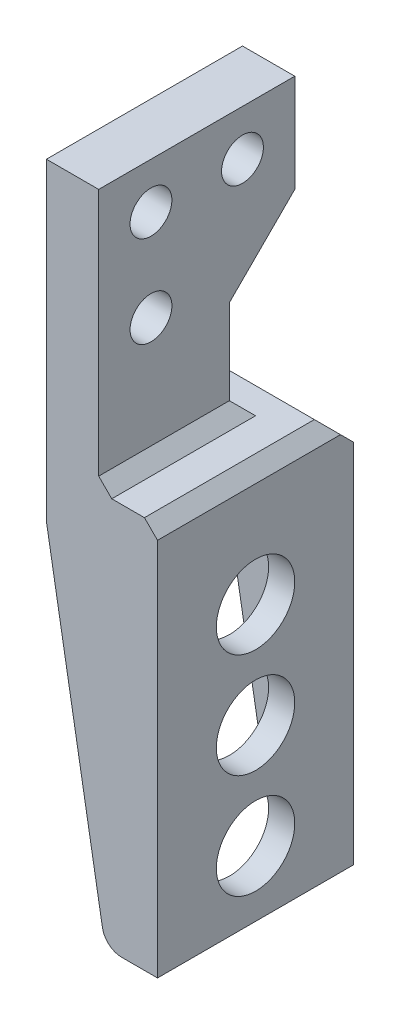
ISO-10303-21;
HEADER;
FILE_DESCRIPTION(('STEP AP214'),'2;1');
FILE_NAME('part.step','',(''),(''),'','','');
FILE_SCHEMA(('AUTOMOTIVE_DESIGN { 1 0 10303 214 1 1 1 1 }'));
ENDSEC;
DATA;
#1=APPLICATION_CONTEXT('core data for automotive mechanical design processes');
#2=APPLICATION_PROTOCOL_DEFINITION('international standard','automotive_design',2000,#1);
#3=PRODUCT_CONTEXT('',#1,'mechanical');
#4=PRODUCT('Part','Part','',(#3));
#5=PRODUCT_RELATED_PRODUCT_CATEGORY('part','',(#4));
#6=PRODUCT_DEFINITION_FORMATION('','',#4);
#7=PRODUCT_DEFINITION_CONTEXT('part definition',#1,'design');
#8=PRODUCT_DEFINITION('design','',#6,#7);
#9=PRODUCT_DEFINITION_SHAPE('','',#8);
#10=(LENGTH_UNIT() NAMED_UNIT(*) SI_UNIT(.MILLI.,.METRE.));
#11=(NAMED_UNIT(*) PLANE_ANGLE_UNIT() SI_UNIT($,.RADIAN.));
#12=(NAMED_UNIT(*) SI_UNIT($,.STERADIAN.) SOLID_ANGLE_UNIT());
#13=UNCERTAINTY_MEASURE_WITH_UNIT(LENGTH_MEASURE(1.E-05),#10,'distance_accuracy_value','');
#14=(GEOMETRIC_REPRESENTATION_CONTEXT(3) GLOBAL_UNCERTAINTY_ASSIGNED_CONTEXT((#13)) GLOBAL_UNIT_ASSIGNED_CONTEXT((#10,
#11,#12)) REPRESENTATION_CONTEXT('',''));
#15=CARTESIAN_POINT('',(0.,0.,0.));
#16=DIRECTION('',(0.,0.,1.));
#17=DIRECTION('',(1.,0.,0.));
#18=AXIS2_PLACEMENT_3D('',#15,#16,#17);
#19=CARTESIAN_POINT('',(0.,0.,-7.5));
#20=DIRECTION('',(0.,0.,-1.));
#21=DIRECTION('',(-1.,0.,0.));
#22=AXIS2_PLACEMENT_3D('',#19,#20,#21);
#23=PLANE('',#22);
#24=DIRECTION('',(0.,-1.,0.));
#25=VECTOR('',#24,1.);
#26=CARTESIAN_POINT('',(0.,-24.,-7.5));
#27=LINE('',#26,#25);
#28=CARTESIAN_POINT('',(0.,-22.,-7.5));
#29=VERTEX_POINT('',#28);
#30=CARTESIAN_POINT('',(0.,-24.,-7.5));
#31=VERTEX_POINT('',#30);
#32=EDGE_CURVE('E242',#29,#31,#27,.T.);
#33=ORIENTED_EDGE('',*,*,#32,.F.);
#34=DIRECTION('',(1.,0.,0.));
#35=VECTOR('',#34,1.);
#36=CARTESIAN_POINT('',(7.5,-22.,-7.5));
#37=LINE('',#36,#35);
#38=CARTESIAN_POINT('',(8.5,-22.,-7.5));
#39=VERTEX_POINT('',#38);
#40=EDGE_CURVE('E58',#29,#39,#37,.T.);
#41=ORIENTED_EDGE('',*,*,#40,.T.);
#42=DIRECTION('',(0.,1.,0.));
#43=VECTOR('',#42,1.);
#44=CARTESIAN_POINT('',(8.5,-20.,-7.5));
#45=LINE('',#44,#43);
#46=CARTESIAN_POINT('',(8.5,-50.,-7.5));
#47=VERTEX_POINT('',#46);
#48=EDGE_CURVE('E271',#47,#39,#45,.T.);
#49=ORIENTED_EDGE('',*,*,#48,.F.);
#50=DIRECTION('',(1.,0.,0.));
#51=VECTOR('',#50,1.);
#52=CARTESIAN_POINT('',(8.5,-50.,-7.5));
#53=LINE('',#52,#51);
#54=CARTESIAN_POINT('',(5.76268555407217,-50.,-7.5));
#55=VERTEX_POINT('',#54);
#56=EDGE_CURVE('E269',#55,#47,#53,.T.);
#57=ORIENTED_EDGE('',*,*,#56,.F.);
#58=CARTESIAN_POINT('',(5.76268555407217,-48.5,-7.5));
#59=DIRECTION('',(0.,0.,-1.));
#60=DIRECTION('',(-1.,0.,0.));
#61=AXIS2_PLACEMENT_3D('',#58,#59,#60);
#62=CIRCLE('',#61,1.5);
#63=CARTESIAN_POINT('',(4.284659795289,-48.7558121505586,-7.5));
#64=VERTEX_POINT('',#63);
#65=EDGE_CURVE('E336',#55,#64,#62,.T.);
#66=ORIENTED_EDGE('',*,*,#65,.T.);
#67=DIRECTION('',(0.170541433705751,-0.985350505855448,0.));
#68=VECTOR('',#67,1.);
#69=CARTESIAN_POINT('',(4.5,-50.,-7.5));
#70=LINE('',#69,#68);
#71=EDGE_CURVE('E266',#31,#64,#70,.T.);
#72=ORIENTED_EDGE('',*,*,#71,.F.);
#73=EDGE_LOOP('',(#33,#41,#49,#57,#66,#72));
#74=FACE_BOUND('',#73,.T.);
#75=ADVANCED_FACE('F35',(#74),#23,.T.);
#76=CARTESIAN_POINT('',(4.5,-50.,7.5));
#77=DIRECTION('',(0.985350505855448,0.170541433705751,0.));
#78=DIRECTION('',(-0.170541433705751,0.985350505855448,0.));
#79=AXIS2_PLACEMENT_3D('',#76,#77,#78);
#80=PLANE('',#79);
#81=ORIENTED_EDGE('',*,*,#71,.T.);
#82=DIRECTION('',(0.,0.,-1.));
#83=VECTOR('',#82,1.);
#84=CARTESIAN_POINT('',(4.284659795289,-48.7558121505586,7.5));
#85=LINE('',#84,#83);
#86=CARTESIAN_POINT('',(4.284659795289,-48.7558121505586,-5.5));
#87=VERTEX_POINT('',#86);
#88=EDGE_CURVE('E338',#64,#87,#85,.F.);
#89=ORIENTED_EDGE('',*,*,#88,.T.);
#90=DIRECTION('',(-0.170541433705751,0.985350505855448,0.));
#91=VECTOR('',#90,1.);
#92=CARTESIAN_POINT('',(4.5,-50.,-5.5));
#93=LINE('',#92,#91);
#94=CARTESIAN_POINT('',(0.51923076923077,-27.,-5.5));
#95=VERTEX_POINT('',#94);
#96=EDGE_CURVE('E240',#87,#95,#93,.T.);
#97=ORIENTED_EDGE('',*,*,#96,.T.);
#98=CARTESIAN_POINT('',(0.519230769230771,-27.,-2.5));
#99=DIRECTION('',(0.985350505855448,0.170541433705751,0.));
#100=DIRECTION('',(-0.170541433705751,0.985350505855448,0.));
#101=AXIS2_PLACEMENT_3D('',#98,#99,#100);
#102=ELLIPSE('',#101,3.0446018773751,3.);
#103=CARTESIAN_POINT('',(0.,-24.,-2.5));
#104=VERTEX_POINT('',#103);
#105=EDGE_CURVE('E319',#95,#104,#102,.T.);
#106=ORIENTED_EDGE('',*,*,#105,.T.);
#107=DIRECTION('',(0.,0.,-1.));
#108=VECTOR('',#107,1.);
#109=CARTESIAN_POINT('',(0.,-24.,7.5));
#110=LINE('',#109,#108);
#111=EDGE_CURVE('E284',#104,#31,#110,.T.);
#112=ORIENTED_EDGE('',*,*,#111,.T.);
#113=EDGE_LOOP('',(#81,#89,#97,#106,#112));
#114=FACE_BOUND('',#113,.T.);
#115=ADVANCED_FACE('F452',(#114),#80,.F.);
#116=CARTESIAN_POINT('',(0.,-24.,7.5));
#117=DIRECTION('',(1.,0.,0.));
#118=DIRECTION('',(0.,0.,-1.));
#119=AXIS2_PLACEMENT_3D('',#116,#117,#118);
#120=PLANE('',#119);
#121=CARTESIAN_POINT('',(0.,-3.5,3.5));
#122=DIRECTION('',(-1.,0.,0.));
#123=DIRECTION('',(0.,0.,1.));
#124=AXIS2_PLACEMENT_3D('',#121,#122,#123);
#125=CIRCLE('',#124,1.6);
#126=CARTESIAN_POINT('',(0.,-3.5,5.1));
#127=VERTEX_POINT('',#126);
#128=EDGE_CURVE('E737',#127,#127,#125,.T.);
#129=ORIENTED_EDGE('',*,*,#128,.F.);
#130=EDGE_LOOP('',(#129));
#131=FACE_BOUND('',#130,.T.);
#132=CARTESIAN_POINT('',(0.,-10.5,3.5));
#133=DIRECTION('',(-1.,0.,0.));
#134=DIRECTION('',(0.,0.,1.));
#135=AXIS2_PLACEMENT_3D('',#132,#133,#134);
#136=CIRCLE('',#135,1.6);
#137=CARTESIAN_POINT('',(0.,-10.5,5.1));
#138=VERTEX_POINT('',#137);
#139=EDGE_CURVE('E365',#138,#138,#136,.T.);
#140=ORIENTED_EDGE('',*,*,#139,.F.);
#141=EDGE_LOOP('',(#140));
#142=FACE_BOUND('',#141,.T.);
#143=CARTESIAN_POINT('',(0.,-3.5,-3.5));
#144=DIRECTION('',(-1.,0.,0.));
#145=DIRECTION('',(0.,0.,1.));
#146=AXIS2_PLACEMENT_3D('',#143,#144,#145);
#147=CIRCLE('',#146,1.6);
#148=CARTESIAN_POINT('',(0.,-3.5,-1.9));
#149=VERTEX_POINT('',#148);
#150=EDGE_CURVE('E216',#149,#149,#147,.T.);
#151=ORIENTED_EDGE('',*,*,#150,.F.);
#152=EDGE_LOOP('',(#151));
#153=FACE_BOUND('',#152,.T.);
#154=DIRECTION('',(0.,0.,1.));
#155=VECTOR('',#154,1.);
#156=CARTESIAN_POINT('',(0.,-20.,-7.5));
#157=LINE('',#156,#155);
#158=CARTESIAN_POINT('',(0.,-20.,-5.5));
#159=VERTEX_POINT('',#158);
#160=CARTESIAN_POINT('',(0.,-20.,-3.5));
#161=VERTEX_POINT('',#160);
#162=EDGE_CURVE('E194',#159,#161,#157,.T.);
#163=ORIENTED_EDGE('',*,*,#162,.F.);
#164=DIRECTION('',(0.,-0.707106781186549,-0.707106781186546));
#165=VECTOR('',#164,1.);
#166=CARTESIAN_POINT('',(0.,-20.,-5.5));
#167=LINE('',#166,#165);
#168=EDGE_CURVE('E368',#159,#29,#167,.T.);
#169=ORIENTED_EDGE('',*,*,#168,.T.);
#170=ORIENTED_EDGE('',*,*,#32,.T.);
#171=ORIENTED_EDGE('',*,*,#111,.F.);
#172=DIRECTION('',(0.,0.,-1.));
#173=VECTOR('',#172,1.);
#174=CARTESIAN_POINT('',(0.,-24.,5.5));
#175=LINE('',#174,#173);
#176=CARTESIAN_POINT('',(0.,-24.,2.5));
#177=VERTEX_POINT('',#176);
#178=EDGE_CURVE('E225',#177,#104,#175,.T.);
#179=ORIENTED_EDGE('',*,*,#178,.F.);
#180=CARTESIAN_POINT('',(0.,-24.,7.5));
#181=VERTEX_POINT('',#180);
#182=EDGE_CURVE('E285',#181,#177,#110,.T.);
#183=ORIENTED_EDGE('',*,*,#182,.F.);
#184=DIRECTION('',(0.,-1.,0.));
#185=VECTOR('',#184,1.);
#186=CARTESIAN_POINT('',(0.,-24.,7.5));
#187=LINE('',#186,#185);
#188=CARTESIAN_POINT('',(0.,0.,7.5));
#189=VERTEX_POINT('',#188);
#190=EDGE_CURVE('E243',#189,#181,#187,.T.);
#191=ORIENTED_EDGE('',*,*,#190,.F.);
#192=DIRECTION('',(0.,0.,-1.));
#193=VECTOR('',#192,1.);
#194=CARTESIAN_POINT('',(0.,0.,7.5));
#195=LINE('',#194,#193);
#196=CARTESIAN_POINT('',(0.,0.,-7.5));
#197=VERTEX_POINT('',#196);
#198=EDGE_CURVE('E262',#189,#197,#195,.T.);
#199=ORIENTED_EDGE('',*,*,#198,.T.);
#200=CARTESIAN_POINT('',(0.,-7.49999999999995,-7.5));
#201=VERTEX_POINT('',#200);
#202=EDGE_CURVE('E263',#197,#201,#27,.T.);
#203=ORIENTED_EDGE('',*,*,#202,.T.);
#204=DIRECTION('',(0.,0.707106781186551,-0.707106781186544));
#205=VECTOR('',#204,1.);
#206=CARTESIAN_POINT('',(0.,-12.5,-2.5));
#207=LINE('',#206,#205);
#208=CARTESIAN_POINT('',(0.,-12.5,-2.5));
#209=VERTEX_POINT('',#208);
#210=EDGE_CURVE('E210',#209,#201,#207,.T.);
#211=ORIENTED_EDGE('',*,*,#210,.F.);
#212=DIRECTION('',(0.,1.,0.));
#213=VECTOR('',#212,1.);
#214=CARTESIAN_POINT('',(0.,-12.5,-2.5));
#215=LINE('',#214,#213);
#216=CARTESIAN_POINT('',(0.,-19.,-2.5));
#217=VERTEX_POINT('',#216);
#218=EDGE_CURVE('E190',#217,#209,#215,.T.);
#219=ORIENTED_EDGE('',*,*,#218,.F.);
#220=DIRECTION('',(0.,0.707106781186552,0.707106781186543));
#221=VECTOR('',#220,1.);
#222=CARTESIAN_POINT('',(0.,-16.5,0.));
#223=LINE('',#222,#221);
#224=EDGE_CURVE('E356',#217,#161,#223,.F.);
#225=ORIENTED_EDGE('',*,*,#224,.T.);
#226=EDGE_LOOP('',(#163,#169,#170,#171,#179,#183,#191,#199,#203,#211,#219,#225));
#227=FACE_BOUND('',#226,.T.);
#228=ADVANCED_FACE('F372',(#131,#142,#153,#227),#120,.F.);
#229=DIRECTION('',(0.170541433705751,-0.985350505855448,0.));
#230=VECTOR('',#229,1.);
#231=CARTESIAN_POINT('',(4.5,-50.,5.5));
#232=LINE('',#231,#230);
#233=CARTESIAN_POINT('',(0.51923076923077,-27.,5.5));
#234=VERTEX_POINT('',#233);
#235=CARTESIAN_POINT('',(4.284659795289,-48.7558121505586,5.5));
#236=VERTEX_POINT('',#235);
#237=EDGE_CURVE('E236',#234,#236,#232,.T.);
#238=ORIENTED_EDGE('',*,*,#237,.T.);
#239=DIRECTION('',(0.,0.,-1.));
#240=VECTOR('',#239,1.);
#241=CARTESIAN_POINT('',(4.284659795289,-48.7558121505586,7.5));
#242=LINE('',#241,#240);
#243=CARTESIAN_POINT('',(4.284659795289,-48.7558121505586,7.5));
#244=VERTEX_POINT('',#243);
#245=EDGE_CURVE('E332',#236,#244,#242,.F.);
#246=ORIENTED_EDGE('',*,*,#245,.T.);
#247=DIRECTION('',(0.170541433705751,-0.985350505855448,0.));
#248=VECTOR('',#247,1.);
#249=CARTESIAN_POINT('',(4.5,-50.,7.5));
#250=LINE('',#249,#248);
#251=EDGE_CURVE('E246',#181,#244,#250,.T.);
#252=ORIENTED_EDGE('',*,*,#251,.F.);
#253=ORIENTED_EDGE('',*,*,#182,.T.);
#254=CARTESIAN_POINT('',(0.51923076923077,-27.,2.5));
#255=DIRECTION('',(0.985350505855448,0.170541433705751,0.));
#256=DIRECTION('',(0.170541433705751,-0.985350505855448,0.));
#257=AXIS2_PLACEMENT_3D('',#254,#255,#256);
#258=ELLIPSE('',#257,3.0446018773751,3.);
#259=EDGE_CURVE('E322',#177,#234,#258,.T.);
#260=ORIENTED_EDGE('',*,*,#259,.T.);
#261=EDGE_LOOP('',(#238,#246,#252,#253,#260));
#262=FACE_BOUND('',#261,.T.);
#263=ADVANCED_FACE('F410',(#262),#80,.F.);
#264=CARTESIAN_POINT('',(8.5,-50.,7.5));
#265=DIRECTION('',(0.,1.,0.));
#266=DIRECTION('',(0.,0.,1.));
#267=AXIS2_PLACEMENT_3D('',#264,#265,#266);
#268=PLANE('',#267);
#269=DIRECTION('',(1.,0.,0.));
#270=VECTOR('',#269,1.);
#271=CARTESIAN_POINT('',(8.5,-50.,7.5));
#272=LINE('',#271,#270);
#273=CARTESIAN_POINT('',(5.76268555407217,-50.,7.5));
#274=VERTEX_POINT('',#273);
#275=CARTESIAN_POINT('',(8.5,-50.,7.5));
#276=VERTEX_POINT('',#275);
#277=EDGE_CURVE('E250',#274,#276,#272,.T.);
#278=ORIENTED_EDGE('',*,*,#277,.F.);
#279=DIRECTION('',(0.,0.,-1.));
#280=VECTOR('',#279,1.);
#281=CARTESIAN_POINT('',(5.76268555407217,-50.,7.5));
#282=LINE('',#281,#280);
#283=CARTESIAN_POINT('',(5.76268555407217,-50.,5.5));
#284=VERTEX_POINT('',#283);
#285=EDGE_CURVE('E327',#274,#284,#282,.T.);
#286=ORIENTED_EDGE('',*,*,#285,.T.);
#287=DIRECTION('',(-1.,0.,0.));
#288=VECTOR('',#287,1.);
#289=CARTESIAN_POINT('',(6.5,-50.,5.5));
#290=LINE('',#289,#288);
#291=CARTESIAN_POINT('',(6.5,-50.,5.5));
#292=VERTEX_POINT('',#291);
#293=EDGE_CURVE('E226',#292,#284,#290,.T.);
#294=ORIENTED_EDGE('',*,*,#293,.F.);
#295=DIRECTION('',(0.,0.,1.));
#296=VECTOR('',#295,1.);
#297=CARTESIAN_POINT('',(6.5,-50.,5.5));
#298=LINE('',#297,#296);
#299=CARTESIAN_POINT('',(6.50000000000001,-50.,-5.5));
#300=VERTEX_POINT('',#299);
#301=EDGE_CURVE('E202',#300,#292,#298,.T.);
#302=ORIENTED_EDGE('',*,*,#301,.F.);
#303=DIRECTION('',(-1.,0.,0.));
#304=VECTOR('',#303,1.);
#305=CARTESIAN_POINT('',(8.50000000000001,-50.,-5.5));
#306=LINE('',#305,#304);
#307=CARTESIAN_POINT('',(5.76268555407217,-50.,-5.5));
#308=VERTEX_POINT('',#307);
#309=EDGE_CURVE('E287',#300,#308,#306,.T.);
#310=ORIENTED_EDGE('',*,*,#309,.T.);
#311=DIRECTION('',(0.,0.,-1.));
#312=VECTOR('',#311,1.);
#313=CARTESIAN_POINT('',(5.76268555407217,-50.,7.5));
#314=LINE('',#313,#312);
#315=EDGE_CURVE('E324',#308,#55,#314,.T.);
#316=ORIENTED_EDGE('',*,*,#315,.T.);
#317=ORIENTED_EDGE('',*,*,#56,.T.);
#318=DIRECTION('',(0.,0.,-1.));
#319=VECTOR('',#318,1.);
#320=CARTESIAN_POINT('',(8.5,-50.,7.5));
#321=LINE('',#320,#319);
#322=EDGE_CURVE('E281',#276,#47,#321,.T.);
#323=ORIENTED_EDGE('',*,*,#322,.F.);
#324=EDGE_LOOP('',(#278,#286,#294,#302,#310,#316,#317,#323));
#325=FACE_BOUND('',#324,.T.);
#326=ADVANCED_FACE('F436',(#325),#268,.F.);
#327=CARTESIAN_POINT('',(8.5,-20.,7.5));
#328=DIRECTION('',(-1.,0.,0.));
#329=DIRECTION('',(0.,-1.,0.));
#330=AXIS2_PLACEMENT_3D('',#327,#328,#329);
#331=PLANE('',#330);
#332=CARTESIAN_POINT('',(8.5,-29.,0.));
#333=DIRECTION('',(-1.,0.,0.));
#334=DIRECTION('',(0.,0.,1.));
#335=AXIS2_PLACEMENT_3D('',#332,#333,#334);
#336=CIRCLE('',#335,3.);
#337=CARTESIAN_POINT('',(8.5,-29.,3.));
#338=VERTEX_POINT('',#337);
#339=EDGE_CURVE('E741',#338,#338,#336,.T.);
#340=ORIENTED_EDGE('',*,*,#339,.T.);
#341=EDGE_LOOP('',(#340));
#342=FACE_BOUND('',#341,.T.);
#343=CARTESIAN_POINT('',(8.5,-37.,0.));
#344=DIRECTION('',(-1.,0.,0.));
#345=DIRECTION('',(0.,0.,1.));
#346=AXIS2_PLACEMENT_3D('',#343,#344,#345);
#347=CIRCLE('',#346,3.);
#348=CARTESIAN_POINT('',(8.5,-37.,3.));
#349=VERTEX_POINT('',#348);
#350=EDGE_CURVE('E743',#349,#349,#347,.T.);
#351=ORIENTED_EDGE('',*,*,#350,.T.);
#352=EDGE_LOOP('',(#351));
#353=FACE_BOUND('',#352,.T.);
#354=CARTESIAN_POINT('',(8.5,-45.,0.));
#355=DIRECTION('',(-1.,0.,0.));
#356=DIRECTION('',(0.,0.,1.));
#357=AXIS2_PLACEMENT_3D('',#354,#355,#356);
#358=CIRCLE('',#357,3.);
#359=CARTESIAN_POINT('',(8.5,-45.,3.));
#360=VERTEX_POINT('',#359);
#361=EDGE_CURVE('E748',#360,#360,#358,.T.);
#362=ORIENTED_EDGE('',*,*,#361,.T.);
#363=EDGE_LOOP('',(#362));
#364=FACE_BOUND('',#363,.T.);
#365=ORIENTED_EDGE('',*,*,#48,.T.);
#366=DIRECTION('',(0.,0.707106781186549,0.707106781186546));
#367=VECTOR('',#366,1.);
#368=CARTESIAN_POINT('',(8.5,-20.,-5.5));
#369=LINE('',#368,#367);
#370=CARTESIAN_POINT('',(8.5,-21.,-6.5));
#371=VERTEX_POINT('',#370);
#372=EDGE_CURVE('E44',#39,#371,#369,.T.);
#373=ORIENTED_EDGE('',*,*,#372,.T.);
#374=DIRECTION('',(0.,0.,1.));
#375=VECTOR('',#374,1.);
#376=CARTESIAN_POINT('',(8.5,-21.,7.5));
#377=LINE('',#376,#375);
#378=CARTESIAN_POINT('',(8.5,-21.,7.5));
#379=VERTEX_POINT('',#378);
#380=EDGE_CURVE('E349',#371,#379,#377,.T.);
#381=ORIENTED_EDGE('',*,*,#380,.T.);
#382=DIRECTION('',(0.,1.,0.));
#383=VECTOR('',#382,1.);
#384=CARTESIAN_POINT('',(8.5,-20.,7.5));
#385=LINE('',#384,#383);
#386=EDGE_CURVE('E252',#276,#379,#385,.T.);
#387=ORIENTED_EDGE('',*,*,#386,.F.);
#388=ORIENTED_EDGE('',*,*,#322,.T.);
#389=EDGE_LOOP('',(#365,#373,#381,#387,#388));
#390=FACE_BOUND('',#389,.T.);
#391=ADVANCED_FACE('F439',(#342,#353,#364,#390),#331,.F.);
#392=CARTESIAN_POINT('',(4.,-20.,7.5));
#393=DIRECTION('',(0.,-1.,0.));
#394=DIRECTION('',(1.,0.,0.));
#395=AXIS2_PLACEMENT_3D('',#392,#393,#394);
#396=PLANE('',#395);
#397=DIRECTION('',(0.,0.,-1.));
#398=VECTOR('',#397,1.);
#399=CARTESIAN_POINT('',(7.50000000000001,-20.,7.5));
#400=LINE('',#399,#398);
#401=CARTESIAN_POINT('',(7.50000000000001,-20.,7.5));
#402=VERTEX_POINT('',#401);
#403=CARTESIAN_POINT('',(7.50000000000001,-20.,-5.5));
#404=VERTEX_POINT('',#403);
#405=EDGE_CURVE('E346',#402,#404,#400,.T.);
#406=ORIENTED_EDGE('',*,*,#405,.T.);
#407=DIRECTION('',(-1.,0.,0.));
#408=VECTOR('',#407,1.);
#409=CARTESIAN_POINT('',(0.,-20.,-5.5));
#410=LINE('',#409,#408);
#411=EDGE_CURVE('E361',#404,#159,#410,.T.);
#412=ORIENTED_EDGE('',*,*,#411,.T.);
#413=ORIENTED_EDGE('',*,*,#162,.T.);
#414=DIRECTION('',(1.,0.,0.));
#415=VECTOR('',#414,1.);
#416=CARTESIAN_POINT('',(4.,-20.,-3.5));
#417=LINE('',#416,#415);
#418=CARTESIAN_POINT('',(5.,-20.,-3.5));
#419=VERTEX_POINT('',#418);
#420=EDGE_CURVE('E344',#161,#419,#417,.T.);
#421=ORIENTED_EDGE('',*,*,#420,.T.);
#422=DIRECTION('',(0.,0.,1.));
#423=VECTOR('',#422,1.);
#424=CARTESIAN_POINT('',(5.,-20.,7.5));
#425=LINE('',#424,#423);
#426=CARTESIAN_POINT('',(5.,-20.,7.5));
#427=VERTEX_POINT('',#426);
#428=EDGE_CURVE('E342',#419,#427,#425,.T.);
#429=ORIENTED_EDGE('',*,*,#428,.T.);
#430=DIRECTION('',(-1.,0.,0.));
#431=VECTOR('',#430,1.);
#432=CARTESIAN_POINT('',(4.,-20.,7.5));
#433=LINE('',#432,#431);
#434=EDGE_CURVE('E255',#402,#427,#433,.T.);
#435=ORIENTED_EDGE('',*,*,#434,.F.);
#436=EDGE_LOOP('',(#406,#412,#413,#421,#429,#435));
#437=FACE_BOUND('',#436,.T.);
#438=ADVANCED_FACE('F384',(#437),#396,.F.);
#439=CARTESIAN_POINT('',(4.,0.,7.5));
#440=DIRECTION('',(-1.,0.,0.));
#441=DIRECTION('',(0.,-1.,0.));
#442=AXIS2_PLACEMENT_3D('',#439,#440,#441);
#443=PLANE('',#442);
#444=CARTESIAN_POINT('',(4.,-3.5,3.5));
#445=DIRECTION('',(-1.,0.,0.));
#446=DIRECTION('',(0.,-1.,0.));
#447=AXIS2_PLACEMENT_3D('',#444,#445,#446);
#448=CIRCLE('',#447,1.6);
#449=CARTESIAN_POINT('',(4.,-5.1,3.5));
#450=VERTEX_POINT('',#449);
#451=EDGE_CURVE('E208',#450,#450,#448,.T.);
#452=ORIENTED_EDGE('',*,*,#451,.T.);
#453=EDGE_LOOP('',(#452));
#454=FACE_BOUND('',#453,.T.);
#455=CARTESIAN_POINT('',(4.,-10.5,3.5));
#456=DIRECTION('',(-1.,0.,0.));
#457=DIRECTION('',(0.,-1.,0.));
#458=AXIS2_PLACEMENT_3D('',#455,#456,#457);
#459=CIRCLE('',#458,1.6);
#460=CARTESIAN_POINT('',(4.,-12.1,3.5));
#461=VERTEX_POINT('',#460);
#462=EDGE_CURVE('E213',#461,#461,#459,.T.);
#463=ORIENTED_EDGE('',*,*,#462,.T.);
#464=EDGE_LOOP('',(#463));
#465=FACE_BOUND('',#464,.T.);
#466=CARTESIAN_POINT('',(4.,-3.5,-3.5));
#467=DIRECTION('',(-1.,0.,0.));
#468=DIRECTION('',(0.,-1.,0.));
#469=AXIS2_PLACEMENT_3D('',#466,#467,#468);
#470=CIRCLE('',#469,1.6);
#471=CARTESIAN_POINT('',(4.,-5.1,-3.5));
#472=VERTEX_POINT('',#471);
#473=EDGE_CURVE('E300',#472,#472,#470,.T.);
#474=ORIENTED_EDGE('',*,*,#473,.T.);
#475=EDGE_LOOP('',(#474));
#476=FACE_BOUND('',#475,.T.);
#477=DIRECTION('',(0.,1.,0.));
#478=VECTOR('',#477,1.);
#479=CARTESIAN_POINT('',(4.,0.,7.5));
#480=LINE('',#479,#478);
#481=CARTESIAN_POINT('',(4.,-19.,7.5));
#482=VERTEX_POINT('',#481);
#483=CARTESIAN_POINT('',(4.,0.,7.5));
#484=VERTEX_POINT('',#483);
#485=EDGE_CURVE('E258',#482,#484,#480,.T.);
#486=ORIENTED_EDGE('',*,*,#485,.F.);
#487=DIRECTION('',(0.,0.,-1.));
#488=VECTOR('',#487,1.);
#489=CARTESIAN_POINT('',(4.,-19.,-2.5));
#490=LINE('',#489,#488);
#491=CARTESIAN_POINT('',(4.,-19.,-2.5));
#492=VERTEX_POINT('',#491);
#493=EDGE_CURVE('E207',#482,#492,#490,.T.);
#494=ORIENTED_EDGE('',*,*,#493,.T.);
#495=DIRECTION('',(0.,-1.,0.));
#496=VECTOR('',#495,1.);
#497=CARTESIAN_POINT('',(4.,-12.5,-2.5));
#498=LINE('',#497,#496);
#499=CARTESIAN_POINT('',(4.,-12.5,-2.5));
#500=VERTEX_POINT('',#499);
#501=EDGE_CURVE('E187',#500,#492,#498,.T.);
#502=ORIENTED_EDGE('',*,*,#501,.F.);
#503=DIRECTION('',(0.,-0.707106781186551,0.707106781186544));
#504=VECTOR('',#503,1.);
#505=CARTESIAN_POINT('',(4.,-12.5,-2.5));
#506=LINE('',#505,#504);
#507=CARTESIAN_POINT('',(4.,-7.49999999999995,-7.5));
#508=VERTEX_POINT('',#507);
#509=EDGE_CURVE('E197',#508,#500,#506,.T.);
#510=ORIENTED_EDGE('',*,*,#509,.F.);
#511=DIRECTION('',(0.,1.,0.));
#512=VECTOR('',#511,1.);
#513=CARTESIAN_POINT('',(4.,0.,-7.5));
#514=LINE('',#513,#512);
#515=CARTESIAN_POINT('',(4.,0.,-7.5));
#516=VERTEX_POINT('',#515);
#517=EDGE_CURVE('E273',#508,#516,#514,.T.);
#518=ORIENTED_EDGE('',*,*,#517,.T.);
#519=DIRECTION('',(0.,0.,-1.));
#520=VECTOR('',#519,1.);
#521=CARTESIAN_POINT('',(4.,0.,7.5));
#522=LINE('',#521,#520);
#523=EDGE_CURVE('E278',#484,#516,#522,.T.);
#524=ORIENTED_EDGE('',*,*,#523,.F.);
#525=EDGE_LOOP('',(#486,#494,#502,#510,#518,#524));
#526=FACE_BOUND('',#525,.T.);
#527=ADVANCED_FACE('F205',(#454,#465,#476,#526),#443,.F.);
#528=CARTESIAN_POINT('',(0.,0.,7.5));
#529=DIRECTION('',(0.,-1.,0.));
#530=DIRECTION('',(0.,0.,-1.));
#531=AXIS2_PLACEMENT_3D('',#528,#529,#530);
#532=PLANE('',#531);
#533=DIRECTION('',(-1.,0.,0.));
#534=VECTOR('',#533,1.);
#535=CARTESIAN_POINT('',(0.,0.,-7.5));
#536=LINE('',#535,#534);
#537=EDGE_CURVE('E247',#516,#197,#536,.T.);
#538=ORIENTED_EDGE('',*,*,#537,.T.);
#539=ORIENTED_EDGE('',*,*,#198,.F.);
#540=DIRECTION('',(-1.,0.,0.));
#541=VECTOR('',#540,1.);
#542=CARTESIAN_POINT('',(0.,0.,7.5));
#543=LINE('',#542,#541);
#544=EDGE_CURVE('E260',#484,#189,#543,.T.);
#545=ORIENTED_EDGE('',*,*,#544,.F.);
#546=ORIENTED_EDGE('',*,*,#523,.T.);
#547=EDGE_LOOP('',(#538,#539,#545,#546));
#548=FACE_BOUND('',#547,.T.);
#549=ADVANCED_FACE('F402',(#548),#532,.F.);
#550=CARTESIAN_POINT('',(0.,0.,7.5));
#551=DIRECTION('',(0.,0.,-1.));
#552=DIRECTION('',(-1.,0.,0.));
#553=AXIS2_PLACEMENT_3D('',#550,#551,#552);
#554=PLANE('',#553);
#555=ORIENTED_EDGE('',*,*,#386,.T.);
#556=DIRECTION('',(0.707106781186543,-0.707106781186552,0.));
#557=VECTOR('',#556,1.);
#558=CARTESIAN_POINT('',(7.50000000000001,-20.,7.5));
#559=LINE('',#558,#557);
#560=EDGE_CURVE('E351',#379,#402,#559,.F.);
#561=ORIENTED_EDGE('',*,*,#560,.T.);
#562=ORIENTED_EDGE('',*,*,#434,.T.);
#563=DIRECTION('',(0.707106781186543,-0.707106781186552,0.));
#564=VECTOR('',#563,1.);
#565=CARTESIAN_POINT('',(-7.49999999999996,-7.49999999999986,7.5));
#566=LINE('',#565,#564);
#567=EDGE_CURVE('E359',#427,#482,#566,.F.);
#568=ORIENTED_EDGE('',*,*,#567,.T.);
#569=ORIENTED_EDGE('',*,*,#485,.T.);
#570=ORIENTED_EDGE('',*,*,#544,.T.);
#571=ORIENTED_EDGE('',*,*,#190,.T.);
#572=ORIENTED_EDGE('',*,*,#251,.T.);
#573=CARTESIAN_POINT('',(5.76268555407217,-48.5,7.5));
#574=DIRECTION('',(0.,0.,-1.));
#575=DIRECTION('',(-1.,0.,0.));
#576=AXIS2_PLACEMENT_3D('',#573,#574,#575);
#577=CIRCLE('',#576,1.5);
#578=EDGE_CURVE('E334',#244,#274,#577,.F.);
#579=ORIENTED_EDGE('',*,*,#578,.T.);
#580=ORIENTED_EDGE('',*,*,#277,.T.);
#581=EDGE_LOOP('',(#555,#561,#562,#568,#569,#570,#571,#572,#579,#580));
#582=FACE_BOUND('',#581,.T.);
#583=ADVANCED_FACE('F388',(#582),#554,.F.);
#584=DIRECTION('',(-1.,0.,0.));
#585=VECTOR('',#584,1.);
#586=CARTESIAN_POINT('',(8.501,-7.49999999999995,-7.5));
#587=LINE('',#586,#585);
#588=EDGE_CURVE('E193',#508,#201,#587,.T.);
#589=ORIENTED_EDGE('',*,*,#588,.T.);
#590=ORIENTED_EDGE('',*,*,#202,.F.);
#591=ORIENTED_EDGE('',*,*,#537,.F.);
#592=ORIENTED_EDGE('',*,*,#517,.F.);
#593=EDGE_LOOP('',(#589,#590,#591,#592));
#594=FACE_BOUND('',#593,.T.);
#595=ADVANCED_FACE('F397',(#594),#23,.T.);
#596=CARTESIAN_POINT('',(6.50000000000001,-24.,-5.5));
#597=DIRECTION('',(0.,0.,-1.));
#598=DIRECTION('',(-1.,0.,0.));
#599=AXIS2_PLACEMENT_3D('',#596,#597,#598);
#600=PLANE('',#599);
#601=ORIENTED_EDGE('',*,*,#96,.F.);
#602=CARTESIAN_POINT('',(5.76268555407217,-48.5,-5.5));
#603=DIRECTION('',(0.,0.,-1.));
#604=DIRECTION('',(-1.,0.,0.));
#605=AXIS2_PLACEMENT_3D('',#602,#603,#604);
#606=CIRCLE('',#605,1.5);
#607=EDGE_CURVE('E340',#87,#308,#606,.F.);
#608=ORIENTED_EDGE('',*,*,#607,.T.);
#609=ORIENTED_EDGE('',*,*,#309,.F.);
#610=DIRECTION('',(0.,-1.,0.));
#611=VECTOR('',#610,1.);
#612=CARTESIAN_POINT('',(6.50000000000001,-24.,-5.5));
#613=LINE('',#612,#611);
#614=CARTESIAN_POINT('',(6.50000000000001,-27.,-5.5));
#615=VERTEX_POINT('',#614);
#616=EDGE_CURVE('E234',#615,#300,#613,.T.);
#617=ORIENTED_EDGE('',*,*,#616,.F.);
#618=DIRECTION('',(1.,0.,0.));
#619=VECTOR('',#618,1.);
#620=CARTESIAN_POINT('',(0.,-27.,-5.5));
#621=LINE('',#620,#619);
#622=EDGE_CURVE('E314',#615,#95,#621,.F.);
#623=ORIENTED_EDGE('',*,*,#622,.T.);
#624=EDGE_LOOP('',(#601,#608,#609,#617,#623));
#625=FACE_BOUND('',#624,.T.);
#626=ADVANCED_FACE('F462',(#625),#600,.F.);
#627=CARTESIAN_POINT('',(6.5,-24.,5.5));
#628=DIRECTION('',(0.,0.,1.));
#629=DIRECTION('',(1.,0.,0.));
#630=AXIS2_PLACEMENT_3D('',#627,#628,#629);
#631=PLANE('',#630);
#632=ORIENTED_EDGE('',*,*,#293,.T.);
#633=CARTESIAN_POINT('',(5.76268555407217,-48.5,5.5));
#634=DIRECTION('',(0.,0.,1.));
#635=DIRECTION('',(1.,0.,0.));
#636=AXIS2_PLACEMENT_3D('',#633,#634,#635);
#637=CIRCLE('',#636,1.5);
#638=EDGE_CURVE('E330',#284,#236,#637,.F.);
#639=ORIENTED_EDGE('',*,*,#638,.T.);
#640=ORIENTED_EDGE('',*,*,#237,.F.);
#641=DIRECTION('',(-1.,0.,0.));
#642=VECTOR('',#641,1.);
#643=CARTESIAN_POINT('',(6.5,-27.,5.5));
#644=LINE('',#643,#642);
#645=CARTESIAN_POINT('',(6.5,-27.,5.5));
#646=VERTEX_POINT('',#645);
#647=EDGE_CURVE('E317',#234,#646,#644,.F.);
#648=ORIENTED_EDGE('',*,*,#647,.T.);
#649=DIRECTION('',(0.,-1.,0.));
#650=VECTOR('',#649,1.);
#651=CARTESIAN_POINT('',(6.5,-24.,5.5));
#652=LINE('',#651,#650);
#653=EDGE_CURVE('E229',#646,#292,#652,.T.);
#654=ORIENTED_EDGE('',*,*,#653,.T.);
#655=EDGE_LOOP('',(#632,#639,#640,#648,#654));
#656=FACE_BOUND('',#655,.T.);
#657=ADVANCED_FACE('F428',(#656),#631,.F.);
#658=CARTESIAN_POINT('',(6.5,-24.,5.5));
#659=DIRECTION('',(1.,0.,0.));
#660=DIRECTION('',(0.,0.,-1.));
#661=AXIS2_PLACEMENT_3D('',#658,#659,#660);
#662=PLANE('',#661);
#663=CARTESIAN_POINT('',(6.50000000000001,-29.,0.));
#664=DIRECTION('',(1.,0.,0.));
#665=DIRECTION('',(0.,0.,-1.));
#666=AXIS2_PLACEMENT_3D('',#663,#664,#665);
#667=CIRCLE('',#666,3.);
#668=CARTESIAN_POINT('',(6.50000000000001,-29.,-3.));
#669=VERTEX_POINT('',#668);
#670=EDGE_CURVE('E297',#669,#669,#667,.T.);
#671=ORIENTED_EDGE('',*,*,#670,.T.);
#672=EDGE_LOOP('',(#671));
#673=FACE_BOUND('',#672,.T.);
#674=CARTESIAN_POINT('',(6.50000000000001,-37.,0.));
#675=DIRECTION('',(1.,0.,0.));
#676=DIRECTION('',(0.,0.,-1.));
#677=AXIS2_PLACEMENT_3D('',#674,#675,#676);
#678=CIRCLE('',#677,3.);
#679=CARTESIAN_POINT('',(6.50000000000001,-37.,-3.));
#680=VERTEX_POINT('',#679);
#681=EDGE_CURVE('E294',#680,#680,#678,.T.);
#682=ORIENTED_EDGE('',*,*,#681,.T.);
#683=EDGE_LOOP('',(#682));
#684=FACE_BOUND('',#683,.T.);
#685=CARTESIAN_POINT('',(6.50000000000001,-45.,0.));
#686=DIRECTION('',(1.,0.,0.));
#687=DIRECTION('',(0.,0.,-1.));
#688=AXIS2_PLACEMENT_3D('',#685,#686,#687);
#689=CIRCLE('',#688,3.);
#690=CARTESIAN_POINT('',(6.50000000000001,-45.,-3.));
#691=VERTEX_POINT('',#690);
#692=EDGE_CURVE('E291',#691,#691,#689,.T.);
#693=ORIENTED_EDGE('',*,*,#692,.T.);
#694=EDGE_LOOP('',(#693));
#695=FACE_BOUND('',#694,.T.);
#696=DIRECTION('',(0.,0.,1.));
#697=VECTOR('',#696,1.);
#698=CARTESIAN_POINT('',(6.5,-24.,5.5));
#699=LINE('',#698,#697);
#700=CARTESIAN_POINT('',(6.50000000000001,-24.,-2.5));
#701=VERTEX_POINT('',#700);
#702=CARTESIAN_POINT('',(6.50000000000001,-24.,2.5));
#703=VERTEX_POINT('',#702);
#704=EDGE_CURVE('E222',#701,#703,#699,.T.);
#705=ORIENTED_EDGE('',*,*,#704,.F.);
#706=CARTESIAN_POINT('',(6.50000000000001,-27.,-2.5));
#707=DIRECTION('',(1.,0.,0.));
#708=DIRECTION('',(0.,0.,-1.));
#709=AXIS2_PLACEMENT_3D('',#706,#707,#708);
#710=CIRCLE('',#709,3.);
#711=EDGE_CURVE('E312',#701,#615,#710,.F.);
#712=ORIENTED_EDGE('',*,*,#711,.T.);
#713=ORIENTED_EDGE('',*,*,#616,.T.);
#714=ORIENTED_EDGE('',*,*,#301,.T.);
#715=ORIENTED_EDGE('',*,*,#653,.F.);
#716=CARTESIAN_POINT('',(6.50000000000001,-27.,2.5));
#717=DIRECTION('',(1.,0.,0.));
#718=DIRECTION('',(0.,0.,-1.));
#719=AXIS2_PLACEMENT_3D('',#716,#717,#718);
#720=CIRCLE('',#719,3.);
#721=EDGE_CURVE('E310',#646,#703,#720,.F.);
#722=ORIENTED_EDGE('',*,*,#721,.T.);
#723=EDGE_LOOP('',(#705,#712,#713,#714,#715,#722));
#724=FACE_BOUND('',#723,.T.);
#725=ADVANCED_FACE('F422',(#673,#684,#695,#724),#662,.F.);
#726=CARTESIAN_POINT('',(0.,-24.,0.));
#727=DIRECTION('',(0.,1.,0.));
#728=DIRECTION('',(0.,0.,1.));
#729=AXIS2_PLACEMENT_3D('',#726,#727,#728);
#730=PLANE('',#729);
#731=ORIENTED_EDGE('',*,*,#178,.T.);
#732=DIRECTION('',(1.,0.,0.));
#733=VECTOR('',#732,1.);
#734=CARTESIAN_POINT('',(6.50000000000001,-24.,-2.5));
#735=LINE('',#734,#733);
#736=EDGE_CURVE('E307',#104,#701,#735,.T.);
#737=ORIENTED_EDGE('',*,*,#736,.T.);
#738=ORIENTED_EDGE('',*,*,#704,.T.);
#739=DIRECTION('',(-1.,0.,0.));
#740=VECTOR('',#739,1.);
#741=CARTESIAN_POINT('',(0.,-24.,2.5));
#742=LINE('',#741,#740);
#743=EDGE_CURVE('E290',#703,#177,#742,.T.);
#744=ORIENTED_EDGE('',*,*,#743,.T.);
#745=EDGE_LOOP('',(#731,#737,#738,#744));
#746=FACE_BOUND('',#745,.T.);
#747=ADVANCED_FACE('F418',(#746),#730,.F.);
#748=CARTESIAN_POINT('',(8.501,-12.5,-2.5));
#749=DIRECTION('',(0.,0.,1.));
#750=DIRECTION('',(0.,-1.,0.));
#751=AXIS2_PLACEMENT_3D('',#748,#749,#750);
#752=PLANE('',#751);
#753=ORIENTED_EDGE('',*,*,#501,.T.);
#754=DIRECTION('',(-1.,0.,0.));
#755=VECTOR('',#754,1.);
#756=CARTESIAN_POINT('',(0.,-19.,-2.5));
#757=LINE('',#756,#755);
#758=EDGE_CURVE('E353',#492,#217,#757,.T.);
#759=ORIENTED_EDGE('',*,*,#758,.T.);
#760=ORIENTED_EDGE('',*,*,#218,.T.);
#761=DIRECTION('',(-1.,0.,0.));
#762=VECTOR('',#761,1.);
#763=CARTESIAN_POINT('',(8.501,-12.5,-2.5));
#764=LINE('',#763,#762);
#765=EDGE_CURVE('E182',#500,#209,#764,.T.);
#766=ORIENTED_EDGE('',*,*,#765,.F.);
#767=EDGE_LOOP('',(#753,#759,#760,#766));
#768=FACE_BOUND('',#767,.T.);
#769=ADVANCED_FACE('F184',(#768),#752,.F.);
#770=CARTESIAN_POINT('',(8.501,-12.5,-2.5));
#771=DIRECTION('',(0.,0.707106781186544,0.707106781186551));
#772=DIRECTION('',(0.,-0.707106781186551,0.707106781186544));
#773=AXIS2_PLACEMENT_3D('',#770,#771,#772);
#774=PLANE('',#773);
#775=ORIENTED_EDGE('',*,*,#509,.T.);
#776=ORIENTED_EDGE('',*,*,#765,.T.);
#777=ORIENTED_EDGE('',*,*,#210,.T.);
#778=ORIENTED_EDGE('',*,*,#588,.F.);
#779=EDGE_LOOP('',(#775,#776,#777,#778));
#780=FACE_BOUND('',#779,.T.);
#781=ADVANCED_FACE('F198',(#780),#774,.F.);
#782=CARTESIAN_POINT('',(8.5,-45.,0.));
#783=DIRECTION('',(-1.,0.,0.));
#784=DIRECTION('',(0.,0.,1.));
#785=AXIS2_PLACEMENT_3D('',#782,#783,#784);
#786=CYLINDRICAL_SURFACE('',#785,3.);
#787=ORIENTED_EDGE('',*,*,#361,.F.);
#788=EDGE_LOOP('',(#787));
#789=FACE_BOUND('',#788,.T.);
#790=ORIENTED_EDGE('',*,*,#692,.F.);
#791=EDGE_LOOP('',(#790));
#792=FACE_BOUND('',#791,.T.);
#793=ADVANCED_FACE('F484',(#789,#792),#786,.F.);
#794=CARTESIAN_POINT('',(8.5,-37.,0.));
#795=DIRECTION('',(-1.,0.,0.));
#796=DIRECTION('',(0.,0.,1.));
#797=AXIS2_PLACEMENT_3D('',#794,#795,#796);
#798=CYLINDRICAL_SURFACE('',#797,3.);
#799=ORIENTED_EDGE('',*,*,#350,.F.);
#800=EDGE_LOOP('',(#799));
#801=FACE_BOUND('',#800,.T.);
#802=ORIENTED_EDGE('',*,*,#681,.F.);
#803=EDGE_LOOP('',(#802));
#804=FACE_BOUND('',#803,.T.);
#805=ADVANCED_FACE('F493',(#801,#804),#798,.F.);
#806=CARTESIAN_POINT('',(8.5,-29.,0.));
#807=DIRECTION('',(-1.,0.,0.));
#808=DIRECTION('',(0.,0.,1.));
#809=AXIS2_PLACEMENT_3D('',#806,#807,#808);
#810=CYLINDRICAL_SURFACE('',#809,3.);
#811=ORIENTED_EDGE('',*,*,#339,.F.);
#812=EDGE_LOOP('',(#811));
#813=FACE_BOUND('',#812,.T.);
#814=ORIENTED_EDGE('',*,*,#670,.F.);
#815=EDGE_LOOP('',(#814));
#816=FACE_BOUND('',#815,.T.);
#817=ADVANCED_FACE('F489',(#813,#816),#810,.F.);
#818=CARTESIAN_POINT('',(8.5,-3.5,-3.5));
#819=DIRECTION('',(-1.,0.,0.));
#820=DIRECTION('',(0.,0.,1.));
#821=AXIS2_PLACEMENT_3D('',#818,#819,#820);
#822=CYLINDRICAL_SURFACE('',#821,1.6);
#823=ORIENTED_EDGE('',*,*,#150,.T.);
#824=EDGE_LOOP('',(#823));
#825=FACE_BOUND('',#824,.T.);
#826=ORIENTED_EDGE('',*,*,#473,.F.);
#827=EDGE_LOOP('',(#826));
#828=FACE_BOUND('',#827,.T.);
#829=ADVANCED_FACE('F485',(#825,#828),#822,.F.);
#830=CARTESIAN_POINT('',(8.5,-10.5,3.5));
#831=DIRECTION('',(-1.,0.,0.));
#832=DIRECTION('',(0.,0.,1.));
#833=AXIS2_PLACEMENT_3D('',#830,#831,#832);
#834=CYLINDRICAL_SURFACE('',#833,1.6);
#835=ORIENTED_EDGE('',*,*,#139,.T.);
#836=EDGE_LOOP('',(#835));
#837=FACE_BOUND('',#836,.T.);
#838=ORIENTED_EDGE('',*,*,#462,.F.);
#839=EDGE_LOOP('',(#838));
#840=FACE_BOUND('',#839,.T.);
#841=ADVANCED_FACE('F488',(#837,#840),#834,.F.);
#842=CARTESIAN_POINT('',(8.5,-3.5,3.5));
#843=DIRECTION('',(-1.,0.,0.));
#844=DIRECTION('',(0.,0.,1.));
#845=AXIS2_PLACEMENT_3D('',#842,#843,#844);
#846=CYLINDRICAL_SURFACE('',#845,1.6);
#847=ORIENTED_EDGE('',*,*,#128,.T.);
#848=EDGE_LOOP('',(#847));
#849=FACE_BOUND('',#848,.T.);
#850=ORIENTED_EDGE('',*,*,#451,.F.);
#851=EDGE_LOOP('',(#850));
#852=FACE_BOUND('',#851,.T.);
#853=ADVANCED_FACE('F501',(#849,#852),#846,.F.);
#854=CARTESIAN_POINT('',(0.,-27.,-2.5));
#855=DIRECTION('',(-1.,0.,0.));
#856=DIRECTION('',(0.,0.,1.));
#857=AXIS2_PLACEMENT_3D('',#854,#855,#856);
#858=CYLINDRICAL_SURFACE('',#857,3.);
#859=ORIENTED_EDGE('',*,*,#105,.F.);
#860=ORIENTED_EDGE('',*,*,#622,.F.);
#861=ORIENTED_EDGE('',*,*,#711,.F.);
#862=ORIENTED_EDGE('',*,*,#736,.F.);
#863=EDGE_LOOP('',(#859,#860,#861,#862));
#864=FACE_BOUND('',#863,.T.);
#865=ADVANCED_FACE('F504',(#864),#858,.F.);
#866=CARTESIAN_POINT('',(0.,-27.,2.5));
#867=DIRECTION('',(1.,0.,0.));
#868=DIRECTION('',(0.,0.,-1.));
#869=AXIS2_PLACEMENT_3D('',#866,#867,#868);
#870=CYLINDRICAL_SURFACE('',#869,3.);
#871=ORIENTED_EDGE('',*,*,#721,.F.);
#872=ORIENTED_EDGE('',*,*,#647,.F.);
#873=ORIENTED_EDGE('',*,*,#259,.F.);
#874=ORIENTED_EDGE('',*,*,#743,.F.);
#875=EDGE_LOOP('',(#871,#872,#873,#874));
#876=FACE_BOUND('',#875,.T.);
#877=ADVANCED_FACE('F416',(#876),#870,.F.);
#878=CARTESIAN_POINT('',(5.76268555407217,-48.5,7.5));
#879=DIRECTION('',(0.,0.,-1.));
#880=DIRECTION('',(-1.,0.,0.));
#881=AXIS2_PLACEMENT_3D('',#878,#879,#880);
#882=CYLINDRICAL_SURFACE('',#881,1.5);
#883=ORIENTED_EDGE('',*,*,#578,.F.);
#884=ORIENTED_EDGE('',*,*,#245,.F.);
#885=ORIENTED_EDGE('',*,*,#638,.F.);
#886=ORIENTED_EDGE('',*,*,#285,.F.);
#887=EDGE_LOOP('',(#883,#884,#885,#886));
#888=FACE_BOUND('',#887,.T.);
#889=ADVANCED_FACE('F431',(#888),#882,.T.);
#890=CARTESIAN_POINT('',(5.76268555407217,-48.5,7.5));
#891=DIRECTION('',(0.,0.,-1.));
#892=DIRECTION('',(-1.,0.,0.));
#893=AXIS2_PLACEMENT_3D('',#890,#891,#892);
#894=CYLINDRICAL_SURFACE('',#893,1.5);
#895=ORIENTED_EDGE('',*,*,#607,.F.);
#896=ORIENTED_EDGE('',*,*,#88,.F.);
#897=ORIENTED_EDGE('',*,*,#65,.F.);
#898=ORIENTED_EDGE('',*,*,#315,.F.);
#899=EDGE_LOOP('',(#895,#896,#897,#898));
#900=FACE_BOUND('',#899,.T.);
#901=ADVANCED_FACE('F650',(#900),#894,.T.);
#902=CARTESIAN_POINT('',(7.50000000000001,-20.,7.5));
#903=DIRECTION('',(-0.707106781186552,-0.707106781186543,0.));
#904=DIRECTION('',(0.,0.,-1.));
#905=AXIS2_PLACEMENT_3D('',#902,#903,#904);
#906=PLANE('',#905);
#907=ORIENTED_EDGE('',*,*,#380,.F.);
#908=DIRECTION('',(0.577350269189621,-0.577350269189629,-0.577350269189627));
#909=VECTOR('',#908,1.);
#910=CARTESIAN_POINT('',(3.1666666666667,-15.6666666666666,-1.16666666666665));
#911=LINE('',#910,#909);
#912=EDGE_CURVE('E11',#371,#404,#911,.F.);
#913=ORIENTED_EDGE('',*,*,#912,.T.);
#914=ORIENTED_EDGE('',*,*,#405,.F.);
#915=ORIENTED_EDGE('',*,*,#560,.F.);
#916=EDGE_LOOP('',(#907,#913,#914,#915));
#917=FACE_BOUND('',#916,.T.);
#918=ADVANCED_FACE('F380',(#917),#906,.F.);
#919=CARTESIAN_POINT('',(4.,-19.,7.5));
#920=DIRECTION('',(0.707106781186552,0.707106781186542,0.));
#921=DIRECTION('',(0.,0.,1.));
#922=AXIS2_PLACEMENT_3D('',#919,#920,#921);
#923=PLANE('',#922);
#924=ORIENTED_EDGE('',*,*,#567,.F.);
#925=ORIENTED_EDGE('',*,*,#428,.F.);
#926=DIRECTION('',(-0.577350269189623,0.577350269189631,0.577350269189623));
#927=VECTOR('',#926,1.);
#928=CARTESIAN_POINT('',(0.666666666666701,-15.6666666666666,0.833333333333305));
#929=LINE('',#928,#927);
#930=EDGE_CURVE('E362',#492,#419,#929,.F.);
#931=ORIENTED_EDGE('',*,*,#930,.F.);
#932=ORIENTED_EDGE('',*,*,#493,.F.);
#933=EDGE_LOOP('',(#924,#925,#931,#932));
#934=FACE_BOUND('',#933,.T.);
#935=ADVANCED_FACE('F390',(#934),#923,.T.);
#936=CARTESIAN_POINT('',(8.501,-19.,-2.5));
#937=DIRECTION('',(0.,0.707106781186543,-0.707106781186552));
#938=DIRECTION('',(1.,0.,0.));
#939=AXIS2_PLACEMENT_3D('',#936,#937,#938);
#940=PLANE('',#939);
#941=ORIENTED_EDGE('',*,*,#930,.T.);
#942=ORIENTED_EDGE('',*,*,#420,.F.);
#943=ORIENTED_EDGE('',*,*,#224,.F.);
#944=ORIENTED_EDGE('',*,*,#758,.F.);
#945=EDGE_LOOP('',(#941,#942,#943,#944));
#946=FACE_BOUND('',#945,.T.);
#947=ADVANCED_FACE('F394',(#946),#940,.T.);
#948=CARTESIAN_POINT('',(4.,-20.,-5.5));
#949=DIRECTION('',(0.,0.707106781186546,-0.707106781186549));
#950=DIRECTION('',(1.,0.,0.));
#951=AXIS2_PLACEMENT_3D('',#948,#949,#950);
#952=PLANE('',#951);
#953=ORIENTED_EDGE('',*,*,#372,.F.);
#954=ORIENTED_EDGE('',*,*,#40,.F.);
#955=ORIENTED_EDGE('',*,*,#168,.F.);
#956=ORIENTED_EDGE('',*,*,#411,.F.);
#957=ORIENTED_EDGE('',*,*,#912,.F.);
#958=EDGE_LOOP('',(#953,#954,#955,#956,#957));
#959=FACE_BOUND('',#958,.T.);
#960=ADVANCED_FACE('F38',(#959),#952,.T.);
#961=CLOSED_SHELL('',(#75,#115,#228,#263,#326,#391,#438,#527,#549,#583,#595,#626,#657,#725,#747,
#769,#781,#793,#805,#817,#829,#841,#853,#865,#877,#889,#901,#918,#935,#947,#960));
#962=MANIFOLD_SOLID_BREP('B2',#961);
#963=ADVANCED_BREP_SHAPE_REPRESENTATION('',(#18,#962),#14);
#964=SHAPE_DEFINITION_REPRESENTATION(#9,#963);
ENDSEC;
END-ISO-10303-21;
